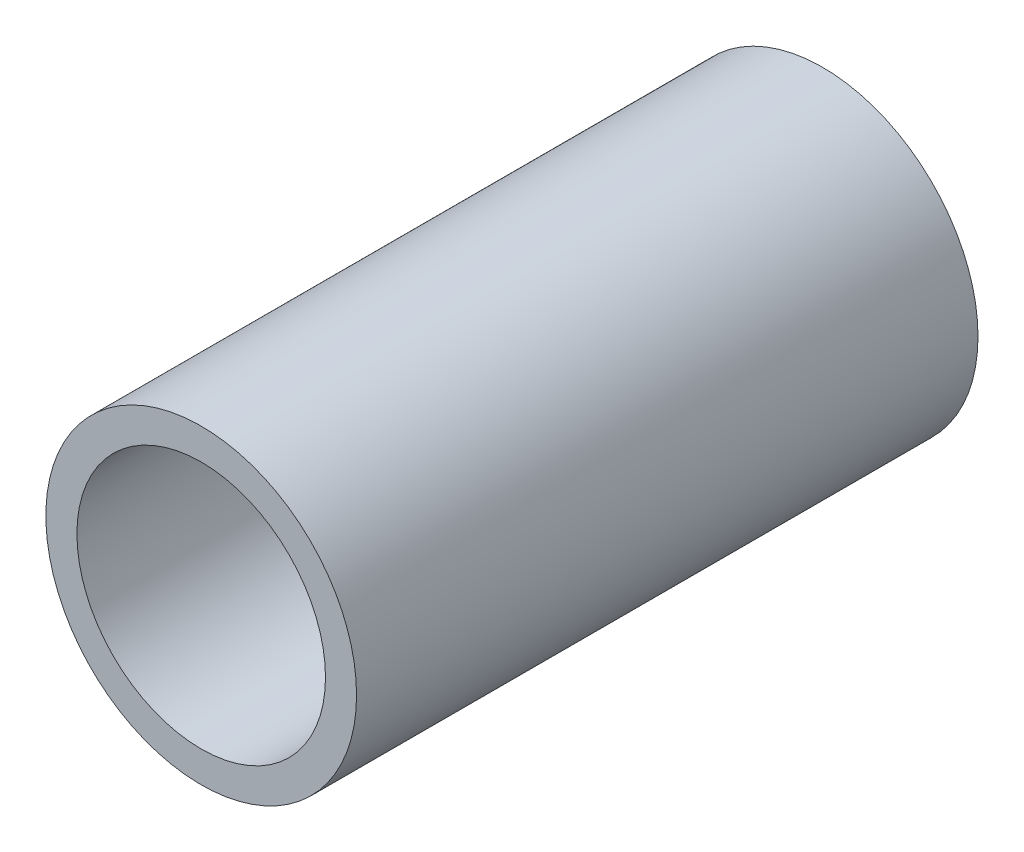
ISO-10303-21;
HEADER;
FILE_DESCRIPTION(('STEP AP214'),'2;1');
FILE_NAME('part.step','',(''),(''),'','','');
FILE_SCHEMA(('AUTOMOTIVE_DESIGN { 1 0 10303 214 1 1 1 1 }'));
ENDSEC;
DATA;
#1=APPLICATION_CONTEXT('core data for automotive mechanical design processes');
#2=APPLICATION_PROTOCOL_DEFINITION('international standard','automotive_design',2000,#1);
#3=PRODUCT_CONTEXT('',#1,'mechanical');
#4=PRODUCT('Part','Part','',(#3));
#5=PRODUCT_RELATED_PRODUCT_CATEGORY('part','',(#4));
#6=PRODUCT_DEFINITION_FORMATION('','',#4);
#7=PRODUCT_DEFINITION_CONTEXT('part definition',#1,'design');
#8=PRODUCT_DEFINITION('design','',#6,#7);
#9=PRODUCT_DEFINITION_SHAPE('','',#8);
#10=(LENGTH_UNIT() NAMED_UNIT(*) SI_UNIT(.MILLI.,.METRE.));
#11=(NAMED_UNIT(*) PLANE_ANGLE_UNIT() SI_UNIT($,.RADIAN.));
#12=(NAMED_UNIT(*) SI_UNIT($,.STERADIAN.) SOLID_ANGLE_UNIT());
#13=UNCERTAINTY_MEASURE_WITH_UNIT(LENGTH_MEASURE(1.E-05),#10,'distance_accuracy_value','');
#14=(GEOMETRIC_REPRESENTATION_CONTEXT(3) GLOBAL_UNCERTAINTY_ASSIGNED_CONTEXT((#13)) GLOBAL_UNIT_ASSIGNED_CONTEXT((#10,
#11,#12)) REPRESENTATION_CONTEXT('',''));
#15=CARTESIAN_POINT('',(0.,0.,0.));
#16=DIRECTION('',(0.,0.,1.));
#17=DIRECTION('',(1.,0.,0.));
#18=AXIS2_PLACEMENT_3D('',#15,#16,#17);
#19=CARTESIAN_POINT('',(0.,0.,127.));
#20=DIRECTION('',(0.,0.,-1.));
#21=DIRECTION('',(-1.,0.,0.));
#22=AXIS2_PLACEMENT_3D('',#19,#20,#21);
#23=CYLINDRICAL_SURFACE('',#22,63.5);
#24=CARTESIAN_POINT('',(0.,0.,127.));
#25=DIRECTION('',(0.,0.,1.));
#26=DIRECTION('',(1.,0.,0.));
#27=AXIS2_PLACEMENT_3D('',#24,#25,#26);
#28=CIRCLE('',#27,63.5);
#29=CARTESIAN_POINT('',(63.5,0.,127.));
#30=VERTEX_POINT('',#29);
#31=EDGE_CURVE('E10',#30,#30,#28,.T.);
#32=ORIENTED_EDGE('',*,*,#31,.F.);
#33=EDGE_LOOP('',(#32));
#34=FACE_BOUND('',#33,.T.);
#35=CARTESIAN_POINT('',(0.,0.,-127.));
#36=DIRECTION('',(0.,0.,1.));
#37=DIRECTION('',(1.,0.,0.));
#38=AXIS2_PLACEMENT_3D('',#35,#36,#37);
#39=CIRCLE('',#38,63.5);
#40=CARTESIAN_POINT('',(63.5,0.,-127.));
#41=VERTEX_POINT('',#40);
#42=EDGE_CURVE('E40',#41,#41,#39,.T.);
#43=ORIENTED_EDGE('',*,*,#42,.T.);
#44=EDGE_LOOP('',(#43));
#45=FACE_BOUND('',#44,.T.);
#46=ADVANCED_FACE('F37',(#34,#45),#23,.T.);
#47=CARTESIAN_POINT('',(0.,0.,127.));
#48=DIRECTION('',(0.,0.,1.));
#49=DIRECTION('',(1.,0.,0.));
#50=AXIS2_PLACEMENT_3D('',#47,#48,#49);
#51=PLANE('',#50);
#52=CARTESIAN_POINT('',(0.,0.,127.));
#53=DIRECTION('',(0.,0.,1.));
#54=DIRECTION('',(1.,0.,0.));
#55=AXIS2_PLACEMENT_3D('',#52,#53,#54);
#56=CIRCLE('',#55,50.8);
#57=CARTESIAN_POINT('',(50.8,0.,127.));
#58=VERTEX_POINT('',#57);
#59=EDGE_CURVE('E49',#58,#58,#56,.T.);
#60=ORIENTED_EDGE('',*,*,#59,.F.);
#61=EDGE_LOOP('',(#60));
#62=FACE_BOUND('',#61,.T.);
#63=ORIENTED_EDGE('',*,*,#31,.T.);
#64=EDGE_LOOP('',(#63));
#65=FACE_BOUND('',#64,.T.);
#66=ADVANCED_FACE('F64',(#62,#65),#51,.T.);
#67=CARTESIAN_POINT('',(0.,0.,-127.));
#68=DIRECTION('',(0.,0.,1.));
#69=DIRECTION('',(1.,0.,0.));
#70=AXIS2_PLACEMENT_3D('',#67,#68,#69);
#71=PLANE('',#70);
#72=CARTESIAN_POINT('',(0.,0.,-127.));
#73=DIRECTION('',(0.,0.,1.));
#74=DIRECTION('',(1.,0.,0.));
#75=AXIS2_PLACEMENT_3D('',#72,#73,#74);
#76=CIRCLE('',#75,50.8);
#77=CARTESIAN_POINT('',(50.8,0.,-127.));
#78=VERTEX_POINT('',#77);
#79=EDGE_CURVE('E47',#78,#78,#76,.T.);
#80=ORIENTED_EDGE('',*,*,#79,.T.);
#81=EDGE_LOOP('',(#80));
#82=FACE_BOUND('',#81,.T.);
#83=ORIENTED_EDGE('',*,*,#42,.F.);
#84=EDGE_LOOP('',(#83));
#85=FACE_BOUND('',#84,.T.);
#86=ADVANCED_FACE('F55',(#82,#85),#71,.F.);
#87=CARTESIAN_POINT('',(0.,0.,-127.));
#88=DIRECTION('',(0.,0.,1.));
#89=DIRECTION('',(1.,0.,0.));
#90=AXIS2_PLACEMENT_3D('',#87,#88,#89);
#91=CYLINDRICAL_SURFACE('',#90,50.8);
#92=ORIENTED_EDGE('',*,*,#79,.F.);
#93=EDGE_LOOP('',(#92));
#94=FACE_BOUND('',#93,.T.);
#95=ORIENTED_EDGE('',*,*,#59,.T.);
#96=EDGE_LOOP('',(#95));
#97=FACE_BOUND('',#96,.T.);
#98=ADVANCED_FACE('F58',(#94,#97),#91,.F.);
#99=CLOSED_SHELL('',(#46,#66,#86,#98));
#100=MANIFOLD_SOLID_BREP('B2',#99);
#101=ADVANCED_BREP_SHAPE_REPRESENTATION('',(#18,#100),#14);
#102=SHAPE_DEFINITION_REPRESENTATION(#9,#101);
ENDSEC;
END-ISO-10303-21;
